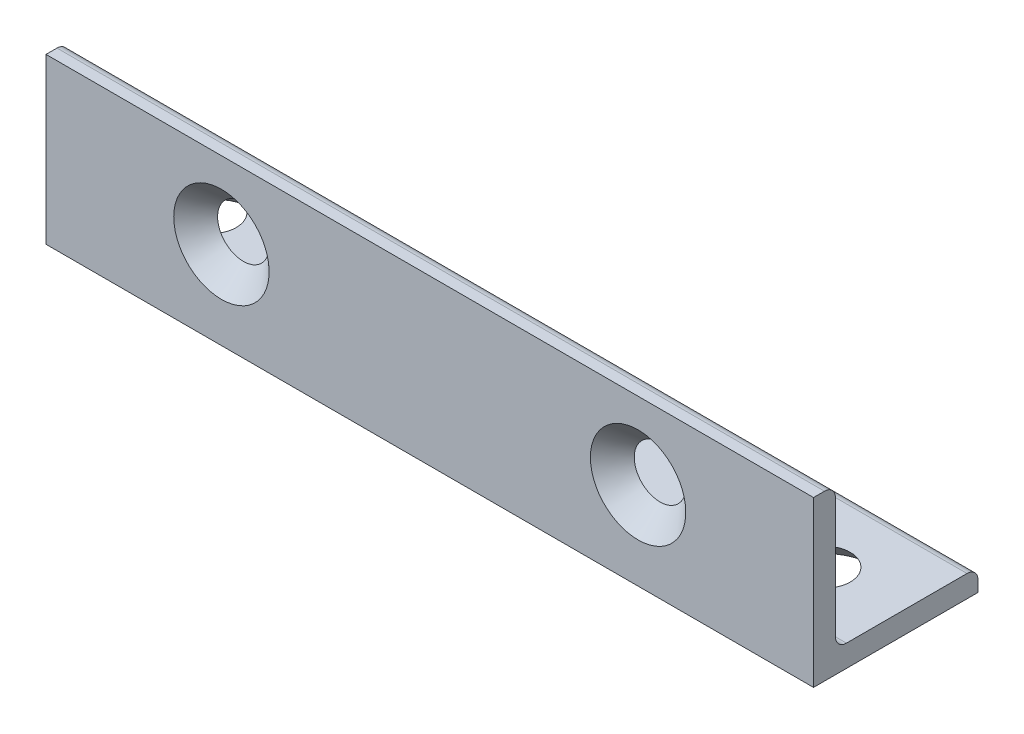
ISO-10303-21;
HEADER;
FILE_DESCRIPTION(('STEP AP214'),'2;1');
FILE_NAME('part.step','',(''),(''),'','','');
FILE_SCHEMA(('AUTOMOTIVE_DESIGN { 1 0 10303 214 1 1 1 1 }'));
ENDSEC;
DATA;
#1=APPLICATION_CONTEXT('core data for automotive mechanical design processes');
#2=APPLICATION_PROTOCOL_DEFINITION('international standard','automotive_design',2000,#1);
#3=PRODUCT_CONTEXT('',#1,'mechanical');
#4=PRODUCT('Part','Part','',(#3));
#5=PRODUCT_RELATED_PRODUCT_CATEGORY('part','',(#4));
#6=PRODUCT_DEFINITION_FORMATION('','',#4);
#7=PRODUCT_DEFINITION_CONTEXT('part definition',#1,'design');
#8=PRODUCT_DEFINITION('design','',#6,#7);
#9=PRODUCT_DEFINITION_SHAPE('','',#8);
#10=(LENGTH_UNIT() NAMED_UNIT(*) SI_UNIT(.MILLI.,.METRE.));
#11=(NAMED_UNIT(*) PLANE_ANGLE_UNIT() SI_UNIT($,.RADIAN.));
#12=(NAMED_UNIT(*) SI_UNIT($,.STERADIAN.) SOLID_ANGLE_UNIT());
#13=UNCERTAINTY_MEASURE_WITH_UNIT(LENGTH_MEASURE(1.E-05),#10,'distance_accuracy_value','');
#14=(GEOMETRIC_REPRESENTATION_CONTEXT(3) GLOBAL_UNCERTAINTY_ASSIGNED_CONTEXT((#13)) GLOBAL_UNIT_ASSIGNED_CONTEXT((#10,
#11,#12)) REPRESENTATION_CONTEXT('',''));
#15=CARTESIAN_POINT('',(0.,0.,0.));
#16=DIRECTION('',(0.,0.,1.));
#17=DIRECTION('',(1.,0.,0.));
#18=AXIS2_PLACEMENT_3D('',#15,#16,#17);
#19=CARTESIAN_POINT('',(70.,0.,0.));
#20=DIRECTION('',(0.,1.,0.));
#21=DIRECTION('',(0.,0.,1.));
#22=AXIS2_PLACEMENT_3D('',#19,#20,#21);
#23=PLANE('',#22);
#24=CARTESIAN_POINT('',(63.,0.,-8.));
#25=DIRECTION('',(0.,1.,0.));
#26=DIRECTION('',(0.,0.,1.));
#27=AXIS2_PLACEMENT_3D('',#24,#25,#26);
#28=CIRCLE('',#27,4.35000000000003);
#29=CARTESIAN_POINT('',(63.,0.,-3.64999999999997));
#30=VERTEX_POINT('',#29);
#31=EDGE_CURVE('E174',#30,#30,#28,.T.);
#32=ORIENTED_EDGE('',*,*,#31,.T.);
#33=EDGE_LOOP('',(#32));
#34=FACE_BOUND('',#33,.T.);
#35=CARTESIAN_POINT('',(7.,0.,-8.));
#36=DIRECTION('',(0.,1.,0.));
#37=DIRECTION('',(0.,0.,1.));
#38=AXIS2_PLACEMENT_3D('',#35,#36,#37);
#39=CIRCLE('',#38,4.35000000000003);
#40=CARTESIAN_POINT('',(7.,0.,-3.64999999999997));
#41=VERTEX_POINT('',#40);
#42=EDGE_CURVE('E171',#41,#41,#39,.T.);
#43=ORIENTED_EDGE('',*,*,#42,.T.);
#44=EDGE_LOOP('',(#43));
#45=FACE_BOUND('',#44,.T.);
#46=DIRECTION('',(0.,0.,-1.));
#47=VECTOR('',#46,1.);
#48=CARTESIAN_POINT('',(0.,0.,0.));
#49=LINE('',#48,#47);
#50=CARTESIAN_POINT('',(0.,0.,0.));
#51=VERTEX_POINT('',#50);
#52=CARTESIAN_POINT('',(0.,0.,-15.));
#53=VERTEX_POINT('',#52);
#54=EDGE_CURVE('E137',#51,#53,#49,.T.);
#55=ORIENTED_EDGE('',*,*,#54,.T.);
#56=DIRECTION('',(-1.,0.,0.));
#57=VECTOR('',#56,1.);
#58=CARTESIAN_POINT('',(70.,0.,-15.));
#59=LINE('',#58,#57);
#60=CARTESIAN_POINT('',(70.,0.,-15.));
#61=VERTEX_POINT('',#60);
#62=EDGE_CURVE('E169',#61,#53,#59,.T.);
#63=ORIENTED_EDGE('',*,*,#62,.F.);
#64=DIRECTION('',(0.,0.,-1.));
#65=VECTOR('',#64,1.);
#66=CARTESIAN_POINT('',(70.,0.,0.));
#67=LINE('',#66,#65);
#68=CARTESIAN_POINT('',(70.,0.,0.));
#69=VERTEX_POINT('',#68);
#70=EDGE_CURVE('E153',#69,#61,#67,.T.);
#71=ORIENTED_EDGE('',*,*,#70,.F.);
#72=DIRECTION('',(-1.,0.,0.));
#73=VECTOR('',#72,1.);
#74=CARTESIAN_POINT('',(70.,0.,0.));
#75=LINE('',#74,#73);
#76=EDGE_CURVE('E133',#69,#51,#75,.T.);
#77=ORIENTED_EDGE('',*,*,#76,.T.);
#78=EDGE_LOOP('',(#55,#63,#71,#77));
#79=FACE_BOUND('',#78,.T.);
#80=ADVANCED_FACE('F33',(#34,#45,#79),#23,.F.);
#81=CARTESIAN_POINT('',(70.,1.,-15.));
#82=DIRECTION('',(0.,0.,1.));
#83=DIRECTION('',(1.,0.,0.));
#84=AXIS2_PLACEMENT_3D('',#81,#82,#83);
#85=PLANE('',#84);
#86=DIRECTION('',(0.,1.,0.));
#87=VECTOR('',#86,1.);
#88=CARTESIAN_POINT('',(0.,1.,-15.));
#89=LINE('',#88,#87);
#90=CARTESIAN_POINT('',(0.,1.,-15.));
#91=VERTEX_POINT('',#90);
#92=EDGE_CURVE('E140',#53,#91,#89,.T.);
#93=ORIENTED_EDGE('',*,*,#92,.T.);
#94=DIRECTION('',(-1.,0.,0.));
#95=VECTOR('',#94,1.);
#96=CARTESIAN_POINT('',(70.,1.,-15.));
#97=LINE('',#96,#95);
#98=CARTESIAN_POINT('',(70.,1.,-15.));
#99=VERTEX_POINT('',#98);
#100=EDGE_CURVE('E166',#99,#91,#97,.T.);
#101=ORIENTED_EDGE('',*,*,#100,.F.);
#102=DIRECTION('',(0.,1.,0.));
#103=VECTOR('',#102,1.);
#104=CARTESIAN_POINT('',(70.,1.,-15.));
#105=LINE('',#104,#103);
#106=EDGE_CURVE('E97',#61,#99,#105,.T.);
#107=ORIENTED_EDGE('',*,*,#106,.F.);
#108=ORIENTED_EDGE('',*,*,#62,.T.);
#109=EDGE_LOOP('',(#93,#101,#107,#108));
#110=FACE_BOUND('',#109,.T.);
#111=ADVANCED_FACE('F212',(#110),#85,.F.);
#112=CARTESIAN_POINT('',(70.,1.,-14.));
#113=DIRECTION('',(-1.,0.,0.));
#114=DIRECTION('',(0.,0.,1.));
#115=AXIS2_PLACEMENT_3D('',#112,#113,#114);
#116=CYLINDRICAL_SURFACE('',#115,1.);
#117=CARTESIAN_POINT('',(0.,1.,-14.));
#118=DIRECTION('',(1.,0.,0.));
#119=DIRECTION('',(0.,0.,1.));
#120=AXIS2_PLACEMENT_3D('',#117,#118,#119);
#121=CIRCLE('',#120,1.);
#122=CARTESIAN_POINT('',(0.,2.,-14.));
#123=VERTEX_POINT('',#122);
#124=EDGE_CURVE('E142',#91,#123,#121,.T.);
#125=ORIENTED_EDGE('',*,*,#124,.T.);
#126=DIRECTION('',(-1.,0.,0.));
#127=VECTOR('',#126,1.);
#128=CARTESIAN_POINT('',(70.,2.,-14.));
#129=LINE('',#128,#127);
#130=CARTESIAN_POINT('',(70.,2.,-14.));
#131=VERTEX_POINT('',#130);
#132=EDGE_CURVE('E163',#131,#123,#129,.T.);
#133=ORIENTED_EDGE('',*,*,#132,.F.);
#134=CARTESIAN_POINT('',(70.,1.,-14.));
#135=DIRECTION('',(1.,0.,0.));
#136=DIRECTION('',(0.,0.,1.));
#137=AXIS2_PLACEMENT_3D('',#134,#135,#136);
#138=CIRCLE('',#137,1.);
#139=EDGE_CURVE('E274',#99,#131,#138,.T.);
#140=ORIENTED_EDGE('',*,*,#139,.F.);
#141=ORIENTED_EDGE('',*,*,#100,.T.);
#142=EDGE_LOOP('',(#125,#133,#140,#141));
#143=FACE_BOUND('',#142,.T.);
#144=ADVANCED_FACE('F218',(#143),#116,.T.);
#145=CARTESIAN_POINT('',(70.,2.,-3.));
#146=DIRECTION('',(0.,-1.,0.));
#147=DIRECTION('',(0.,0.,-1.));
#148=AXIS2_PLACEMENT_3D('',#145,#146,#147);
#149=PLANE('',#148);
#150=CARTESIAN_POINT('',(63.,2.,-8.));
#151=DIRECTION('',(0.,-1.,0.));
#152=DIRECTION('',(0.,0.,-1.));
#153=AXIS2_PLACEMENT_3D('',#150,#151,#152);
#154=CIRCLE('',#153,2.35000000000001);
#155=CARTESIAN_POINT('',(63.,2.,-10.35));
#156=VERTEX_POINT('',#155);
#157=EDGE_CURVE('E180',#156,#156,#154,.T.);
#158=ORIENTED_EDGE('',*,*,#157,.T.);
#159=EDGE_LOOP('',(#158));
#160=FACE_BOUND('',#159,.T.);
#161=CARTESIAN_POINT('',(7.,2.,-8.));
#162=DIRECTION('',(0.,-1.,0.));
#163=DIRECTION('',(0.,0.,-1.));
#164=AXIS2_PLACEMENT_3D('',#161,#162,#163);
#165=CIRCLE('',#164,2.35000000000001);
#166=CARTESIAN_POINT('',(7.,2.,-10.35));
#167=VERTEX_POINT('',#166);
#168=EDGE_CURVE('E177',#167,#167,#165,.T.);
#169=ORIENTED_EDGE('',*,*,#168,.T.);
#170=EDGE_LOOP('',(#169));
#171=FACE_BOUND('',#170,.T.);
#172=DIRECTION('',(0.,0.,1.));
#173=VECTOR('',#172,1.);
#174=CARTESIAN_POINT('',(0.,2.,-3.));
#175=LINE('',#174,#173);
#176=CARTESIAN_POINT('',(0.,2.,-3.));
#177=VERTEX_POINT('',#176);
#178=EDGE_CURVE('E144',#123,#177,#175,.T.);
#179=ORIENTED_EDGE('',*,*,#178,.T.);
#180=DIRECTION('',(-1.,0.,0.));
#181=VECTOR('',#180,1.);
#182=CARTESIAN_POINT('',(70.,2.,-3.));
#183=LINE('',#182,#181);
#184=CARTESIAN_POINT('',(70.,2.,-3.));
#185=VERTEX_POINT('',#184);
#186=EDGE_CURVE('E160',#185,#177,#183,.T.);
#187=ORIENTED_EDGE('',*,*,#186,.F.);
#188=DIRECTION('',(0.,0.,1.));
#189=VECTOR('',#188,1.);
#190=CARTESIAN_POINT('',(70.,2.,-3.));
#191=LINE('',#190,#189);
#192=EDGE_CURVE('E264',#131,#185,#191,.T.);
#193=ORIENTED_EDGE('',*,*,#192,.F.);
#194=ORIENTED_EDGE('',*,*,#132,.T.);
#195=EDGE_LOOP('',(#179,#187,#193,#194));
#196=FACE_BOUND('',#195,.T.);
#197=ADVANCED_FACE('F246',(#160,#171,#196),#149,.F.);
#198=CARTESIAN_POINT('',(70.,3.,-3.));
#199=DIRECTION('',(-1.,0.,0.));
#200=DIRECTION('',(0.,0.,1.));
#201=AXIS2_PLACEMENT_3D('',#198,#199,#200);
#202=CYLINDRICAL_SURFACE('',#201,1.);
#203=CARTESIAN_POINT('',(0.,3.,-3.));
#204=DIRECTION('',(-1.,0.,0.));
#205=DIRECTION('',(0.,0.,-1.));
#206=AXIS2_PLACEMENT_3D('',#203,#204,#205);
#207=CIRCLE('',#206,1.);
#208=CARTESIAN_POINT('',(0.,3.,-2.));
#209=VERTEX_POINT('',#208);
#210=EDGE_CURVE('E146',#177,#209,#207,.T.);
#211=ORIENTED_EDGE('',*,*,#210,.T.);
#212=DIRECTION('',(-1.,0.,0.));
#213=VECTOR('',#212,1.);
#214=CARTESIAN_POINT('',(70.,3.,-2.));
#215=LINE('',#214,#213);
#216=CARTESIAN_POINT('',(70.,3.,-2.));
#217=VERTEX_POINT('',#216);
#218=EDGE_CURVE('E157',#217,#209,#215,.T.);
#219=ORIENTED_EDGE('',*,*,#218,.F.);
#220=CARTESIAN_POINT('',(70.,3.,-3.));
#221=DIRECTION('',(-1.,0.,0.));
#222=DIRECTION('',(0.,0.,-1.));
#223=AXIS2_PLACEMENT_3D('',#220,#221,#222);
#224=CIRCLE('',#223,1.);
#225=EDGE_CURVE('E270',#185,#217,#224,.T.);
#226=ORIENTED_EDGE('',*,*,#225,.F.);
#227=ORIENTED_EDGE('',*,*,#186,.T.);
#228=EDGE_LOOP('',(#211,#219,#226,#227));
#229=FACE_BOUND('',#228,.T.);
#230=ADVANCED_FACE('F239',(#229),#202,.F.);
#231=CARTESIAN_POINT('',(70.,14.,-2.));
#232=DIRECTION('',(0.,0.,1.));
#233=DIRECTION('',(0.,-1.,0.));
#234=AXIS2_PLACEMENT_3D('',#231,#232,#233);
#235=PLANE('',#234);
#236=CARTESIAN_POINT('',(54.,8.,-2.));
#237=DIRECTION('',(0.,0.,1.));
#238=DIRECTION('',(0.,-1.,0.));
#239=AXIS2_PLACEMENT_3D('',#236,#237,#238);
#240=CIRCLE('',#239,2.35000000000001);
#241=CARTESIAN_POINT('',(54.,5.64999999999999,-2.));
#242=VERTEX_POINT('',#241);
#243=EDGE_CURVE('E11',#242,#242,#240,.T.);
#244=ORIENTED_EDGE('',*,*,#243,.T.);
#245=EDGE_LOOP('',(#244));
#246=FACE_BOUND('',#245,.T.);
#247=CARTESIAN_POINT('',(16.,8.,-2.));
#248=DIRECTION('',(0.,0.,1.));
#249=DIRECTION('',(0.,-1.,0.));
#250=AXIS2_PLACEMENT_3D('',#247,#248,#249);
#251=CIRCLE('',#250,2.35000000000001);
#252=CARTESIAN_POINT('',(16.,5.64999999999999,-2.));
#253=VERTEX_POINT('',#252);
#254=EDGE_CURVE('E42',#253,#253,#251,.T.);
#255=ORIENTED_EDGE('',*,*,#254,.T.);
#256=EDGE_LOOP('',(#255));
#257=FACE_BOUND('',#256,.T.);
#258=DIRECTION('',(0.,1.,0.));
#259=VECTOR('',#258,1.);
#260=CARTESIAN_POINT('',(0.,14.,-2.));
#261=LINE('',#260,#259);
#262=CARTESIAN_POINT('',(0.,14.,-2.));
#263=VERTEX_POINT('',#262);
#264=EDGE_CURVE('E148',#209,#263,#261,.T.);
#265=ORIENTED_EDGE('',*,*,#264,.T.);
#266=DIRECTION('',(-1.,0.,0.));
#267=VECTOR('',#266,1.);
#268=CARTESIAN_POINT('',(70.,14.,-2.));
#269=LINE('',#268,#267);
#270=CARTESIAN_POINT('',(70.,14.,-2.));
#271=VERTEX_POINT('',#270);
#272=EDGE_CURVE('E128',#271,#263,#269,.T.);
#273=ORIENTED_EDGE('',*,*,#272,.F.);
#274=DIRECTION('',(0.,1.,0.));
#275=VECTOR('',#274,1.);
#276=CARTESIAN_POINT('',(70.,14.,-2.));
#277=LINE('',#276,#275);
#278=EDGE_CURVE('E119',#217,#271,#277,.T.);
#279=ORIENTED_EDGE('',*,*,#278,.F.);
#280=ORIENTED_EDGE('',*,*,#218,.T.);
#281=EDGE_LOOP('',(#265,#273,#279,#280));
#282=FACE_BOUND('',#281,.T.);
#283=ADVANCED_FACE('F191',(#246,#257,#282),#235,.F.);
#284=CARTESIAN_POINT('',(70.,14.,-1.));
#285=DIRECTION('',(-1.,0.,0.));
#286=DIRECTION('',(0.,0.,1.));
#287=AXIS2_PLACEMENT_3D('',#284,#285,#286);
#288=CYLINDRICAL_SURFACE('',#287,1.);
#289=CARTESIAN_POINT('',(0.,14.,-1.));
#290=DIRECTION('',(1.,0.,0.));
#291=DIRECTION('',(0.,0.,1.));
#292=AXIS2_PLACEMENT_3D('',#289,#290,#291);
#293=CIRCLE('',#292,1.);
#294=CARTESIAN_POINT('',(0.,15.,-1.));
#295=VERTEX_POINT('',#294);
#296=EDGE_CURVE('E127',#263,#295,#293,.T.);
#297=ORIENTED_EDGE('',*,*,#296,.T.);
#298=DIRECTION('',(-1.,0.,0.));
#299=VECTOR('',#298,1.);
#300=CARTESIAN_POINT('',(70.,15.,-1.));
#301=LINE('',#300,#299);
#302=CARTESIAN_POINT('',(70.,15.,-1.));
#303=VERTEX_POINT('',#302);
#304=EDGE_CURVE('E124',#303,#295,#301,.T.);
#305=ORIENTED_EDGE('',*,*,#304,.F.);
#306=CARTESIAN_POINT('',(70.,14.,-1.));
#307=DIRECTION('',(1.,0.,0.));
#308=DIRECTION('',(0.,0.,1.));
#309=AXIS2_PLACEMENT_3D('',#306,#307,#308);
#310=CIRCLE('',#309,1.);
#311=EDGE_CURVE('E113',#271,#303,#310,.T.);
#312=ORIENTED_EDGE('',*,*,#311,.F.);
#313=ORIENTED_EDGE('',*,*,#272,.T.);
#314=EDGE_LOOP('',(#297,#305,#312,#313));
#315=FACE_BOUND('',#314,.T.);
#316=ADVANCED_FACE('F125',(#315),#288,.T.);
#317=CARTESIAN_POINT('',(70.,15.,0.));
#318=DIRECTION('',(0.,-1.,0.));
#319=DIRECTION('',(0.,0.,-1.));
#320=AXIS2_PLACEMENT_3D('',#317,#318,#319);
#321=PLANE('',#320);
#322=DIRECTION('',(0.,0.,1.));
#323=VECTOR('',#322,1.);
#324=CARTESIAN_POINT('',(0.,15.,0.));
#325=LINE('',#324,#323);
#326=CARTESIAN_POINT('',(0.,15.,0.));
#327=VERTEX_POINT('',#326);
#328=EDGE_CURVE('E82',#295,#327,#325,.T.);
#329=ORIENTED_EDGE('',*,*,#328,.T.);
#330=DIRECTION('',(-1.,0.,0.));
#331=VECTOR('',#330,1.);
#332=CARTESIAN_POINT('',(70.,15.,0.));
#333=LINE('',#332,#331);
#334=CARTESIAN_POINT('',(70.,15.,0.));
#335=VERTEX_POINT('',#334);
#336=EDGE_CURVE('E129',#335,#327,#333,.T.);
#337=ORIENTED_EDGE('',*,*,#336,.F.);
#338=DIRECTION('',(0.,0.,1.));
#339=VECTOR('',#338,1.);
#340=CARTESIAN_POINT('',(70.,15.,0.));
#341=LINE('',#340,#339);
#342=EDGE_CURVE('E117',#303,#335,#341,.T.);
#343=ORIENTED_EDGE('',*,*,#342,.F.);
#344=ORIENTED_EDGE('',*,*,#304,.T.);
#345=EDGE_LOOP('',(#329,#337,#343,#344));
#346=FACE_BOUND('',#345,.T.);
#347=ADVANCED_FACE('F131',(#346),#321,.F.);
#348=CARTESIAN_POINT('',(70.,0.,0.));
#349=DIRECTION('',(0.,0.,-1.));
#350=DIRECTION('',(-1.,0.,0.));
#351=AXIS2_PLACEMENT_3D('',#348,#349,#350);
#352=PLANE('',#351);
#353=CARTESIAN_POINT('',(54.,8.,0.));
#354=DIRECTION('',(0.,0.,-1.));
#355=DIRECTION('',(-1.,0.,0.));
#356=AXIS2_PLACEMENT_3D('',#353,#354,#355);
#357=CIRCLE('',#356,4.35000000000003);
#358=CARTESIAN_POINT('',(49.65,8.,0.));
#359=VERTEX_POINT('',#358);
#360=EDGE_CURVE('E186',#359,#359,#357,.T.);
#361=ORIENTED_EDGE('',*,*,#360,.T.);
#362=EDGE_LOOP('',(#361));
#363=FACE_BOUND('',#362,.T.);
#364=CARTESIAN_POINT('',(16.,8.,0.));
#365=DIRECTION('',(0.,0.,-1.));
#366=DIRECTION('',(-1.,0.,0.));
#367=AXIS2_PLACEMENT_3D('',#364,#365,#366);
#368=CIRCLE('',#367,4.35000000000003);
#369=CARTESIAN_POINT('',(11.65,8.,0.));
#370=VERTEX_POINT('',#369);
#371=EDGE_CURVE('E183',#370,#370,#368,.T.);
#372=ORIENTED_EDGE('',*,*,#371,.T.);
#373=EDGE_LOOP('',(#372));
#374=FACE_BOUND('',#373,.T.);
#375=DIRECTION('',(0.,-1.,0.));
#376=VECTOR('',#375,1.);
#377=CARTESIAN_POINT('',(0.,0.,0.));
#378=LINE('',#377,#376);
#379=EDGE_CURVE('E88',#327,#51,#378,.T.);
#380=ORIENTED_EDGE('',*,*,#379,.T.);
#381=ORIENTED_EDGE('',*,*,#76,.F.);
#382=DIRECTION('',(0.,-1.,0.));
#383=VECTOR('',#382,1.);
#384=CARTESIAN_POINT('',(70.,0.,0.));
#385=LINE('',#384,#383);
#386=EDGE_CURVE('E50',#335,#69,#385,.T.);
#387=ORIENTED_EDGE('',*,*,#386,.F.);
#388=ORIENTED_EDGE('',*,*,#336,.T.);
#389=EDGE_LOOP('',(#380,#381,#387,#388));
#390=FACE_BOUND('',#389,.T.);
#391=ADVANCED_FACE('F199',(#363,#374,#390),#352,.F.);
#392=CARTESIAN_POINT('',(70.,1.,-14.));
#393=DIRECTION('',(-1.,0.,0.));
#394=DIRECTION('',(0.,0.,1.));
#395=AXIS2_PLACEMENT_3D('',#392,#393,#394);
#396=PLANE('',#395);
#397=ORIENTED_EDGE('',*,*,#70,.T.);
#398=ORIENTED_EDGE('',*,*,#106,.T.);
#399=ORIENTED_EDGE('',*,*,#139,.T.);
#400=ORIENTED_EDGE('',*,*,#192,.T.);
#401=ORIENTED_EDGE('',*,*,#225,.T.);
#402=ORIENTED_EDGE('',*,*,#278,.T.);
#403=ORIENTED_EDGE('',*,*,#311,.T.);
#404=ORIENTED_EDGE('',*,*,#342,.T.);
#405=ORIENTED_EDGE('',*,*,#386,.T.);
#406=EDGE_LOOP('',(#397,#398,#399,#400,#401,#402,#403,#404,#405));
#407=FACE_BOUND('',#406,.T.);
#408=ADVANCED_FACE('F115',(#407),#396,.F.);
#409=CARTESIAN_POINT('',(0.,1.,-14.));
#410=DIRECTION('',(-1.,0.,0.));
#411=DIRECTION('',(0.,0.,1.));
#412=AXIS2_PLACEMENT_3D('',#409,#410,#411);
#413=PLANE('',#412);
#414=ORIENTED_EDGE('',*,*,#54,.F.);
#415=ORIENTED_EDGE('',*,*,#379,.F.);
#416=ORIENTED_EDGE('',*,*,#328,.F.);
#417=ORIENTED_EDGE('',*,*,#296,.F.);
#418=ORIENTED_EDGE('',*,*,#264,.F.);
#419=ORIENTED_EDGE('',*,*,#210,.F.);
#420=ORIENTED_EDGE('',*,*,#178,.F.);
#421=ORIENTED_EDGE('',*,*,#124,.F.);
#422=ORIENTED_EDGE('',*,*,#92,.F.);
#423=EDGE_LOOP('',(#414,#415,#416,#417,#418,#419,#420,#421,#422));
#424=FACE_BOUND('',#423,.T.);
#425=ADVANCED_FACE('F207',(#424),#413,.T.);
#426=CARTESIAN_POINT('',(63.,0.,-8.));
#427=DIRECTION('',(0.,-1.,0.));
#428=DIRECTION('',(0.,0.,-1.));
#429=AXIS2_PLACEMENT_3D('',#426,#427,#428);
#430=CONICAL_SURFACE('',#429,4.35000000000003,0.785398163397454);
#431=ORIENTED_EDGE('',*,*,#157,.F.);
#432=EDGE_LOOP('',(#431));
#433=FACE_BOUND('',#432,.T.);
#434=ORIENTED_EDGE('',*,*,#31,.F.);
#435=EDGE_LOOP('',(#434));
#436=FACE_BOUND('',#435,.T.);
#437=ADVANCED_FACE('F223',(#433,#436),#430,.F.);
#438=CARTESIAN_POINT('',(7.,0.,-8.));
#439=DIRECTION('',(0.,-1.,0.));
#440=DIRECTION('',(0.,0.,-1.));
#441=AXIS2_PLACEMENT_3D('',#438,#439,#440);
#442=CONICAL_SURFACE('',#441,4.35000000000003,0.785398163397453);
#443=ORIENTED_EDGE('',*,*,#168,.F.);
#444=EDGE_LOOP('',(#443));
#445=FACE_BOUND('',#444,.T.);
#446=ORIENTED_EDGE('',*,*,#42,.F.);
#447=EDGE_LOOP('',(#446));
#448=FACE_BOUND('',#447,.T.);
#449=ADVANCED_FACE('F226',(#445,#448),#442,.F.);
#450=CARTESIAN_POINT('',(54.,8.,0.));
#451=DIRECTION('',(0.,0.,1.));
#452=DIRECTION('',(1.,0.,0.));
#453=AXIS2_PLACEMENT_3D('',#450,#451,#452);
#454=CONICAL_SURFACE('',#453,4.35000000000003,0.785398163397453);
#455=ORIENTED_EDGE('',*,*,#243,.F.);
#456=EDGE_LOOP('',(#455));
#457=FACE_BOUND('',#456,.T.);
#458=ORIENTED_EDGE('',*,*,#360,.F.);
#459=EDGE_LOOP('',(#458));
#460=FACE_BOUND('',#459,.T.);
#461=ADVANCED_FACE('F196',(#457,#460),#454,.F.);
#462=CARTESIAN_POINT('',(16.,8.,0.));
#463=DIRECTION('',(0.,0.,1.));
#464=DIRECTION('',(1.,0.,0.));
#465=AXIS2_PLACEMENT_3D('',#462,#463,#464);
#466=CONICAL_SURFACE('',#465,4.35000000000003,0.785398163397453);
#467=ORIENTED_EDGE('',*,*,#254,.F.);
#468=EDGE_LOOP('',(#467));
#469=FACE_BOUND('',#468,.T.);
#470=ORIENTED_EDGE('',*,*,#371,.F.);
#471=EDGE_LOOP('',(#470));
#472=FACE_BOUND('',#471,.T.);
#473=ADVANCED_FACE('F35',(#469,#472),#466,.F.);
#474=CLOSED_SHELL('',(#80,#111,#144,#197,#230,#283,#316,#347,#391,#408,#425,#437,#449,#461,#473));
#475=MANIFOLD_SOLID_BREP('B2',#474);
#476=ADVANCED_BREP_SHAPE_REPRESENTATION('',(#18,#475),#14);
#477=SHAPE_DEFINITION_REPRESENTATION(#9,#476);
ENDSEC;
END-ISO-10303-21;
